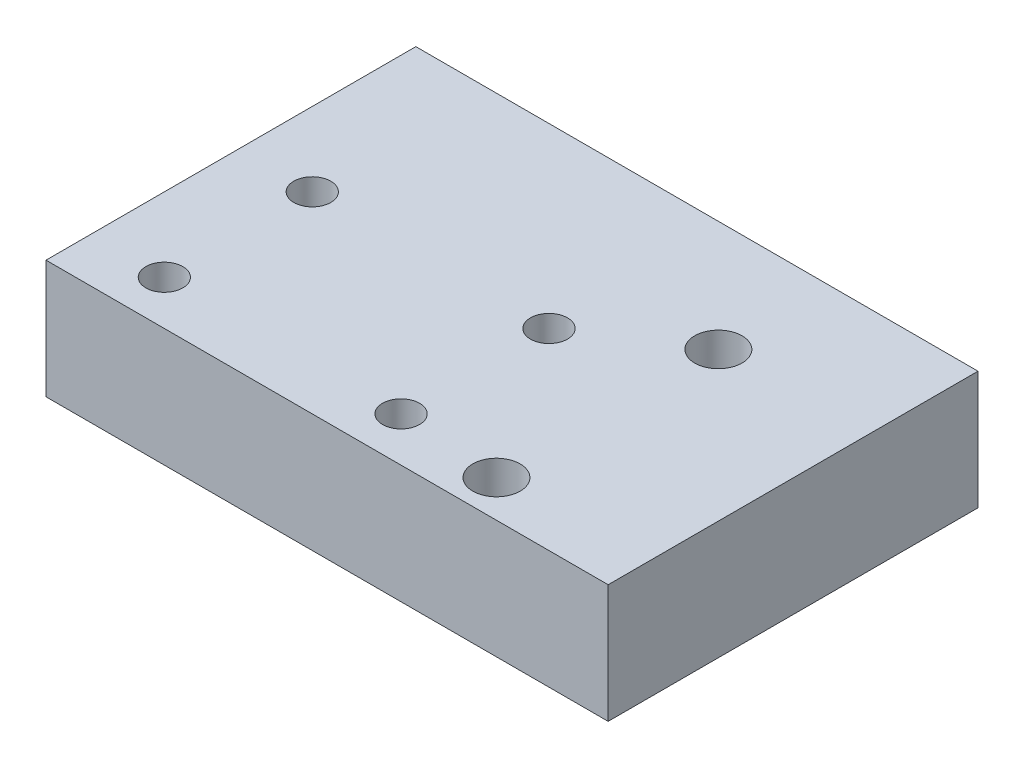
ISO-10303-21;
HEADER;
FILE_DESCRIPTION(('STEP AP214'),'2;1');
FILE_NAME('part.step','',(''),(''),'','','');
FILE_SCHEMA(('AUTOMOTIVE_DESIGN { 1 0 10303 214 1 1 1 1 }'));
ENDSEC;
DATA;
#1=APPLICATION_CONTEXT('core data for automotive mechanical design processes');
#2=APPLICATION_PROTOCOL_DEFINITION('international standard','automotive_design',2000,#1);
#3=PRODUCT_CONTEXT('',#1,'mechanical');
#4=PRODUCT('Part','Part','',(#3));
#5=PRODUCT_RELATED_PRODUCT_CATEGORY('part','',(#4));
#6=PRODUCT_DEFINITION_FORMATION('','',#4);
#7=PRODUCT_DEFINITION_CONTEXT('part definition',#1,'design');
#8=PRODUCT_DEFINITION('design','',#6,#7);
#9=PRODUCT_DEFINITION_SHAPE('','',#8);
#10=(LENGTH_UNIT() NAMED_UNIT(*) SI_UNIT(.MILLI.,.METRE.));
#11=(NAMED_UNIT(*) PLANE_ANGLE_UNIT() SI_UNIT($,.RADIAN.));
#12=(NAMED_UNIT(*) SI_UNIT($,.STERADIAN.) SOLID_ANGLE_UNIT());
#13=UNCERTAINTY_MEASURE_WITH_UNIT(LENGTH_MEASURE(1.E-05),#10,'distance_accuracy_value','');
#14=(GEOMETRIC_REPRESENTATION_CONTEXT(3) GLOBAL_UNCERTAINTY_ASSIGNED_CONTEXT((#13)) GLOBAL_UNIT_ASSIGNED_CONTEXT((#10,
#11,#12)) REPRESENTATION_CONTEXT('',''));
#15=CARTESIAN_POINT('',(0.,0.,0.));
#16=DIRECTION('',(0.,0.,1.));
#17=DIRECTION('',(1.,0.,0.));
#18=AXIS2_PLACEMENT_3D('',#15,#16,#17);
#19=CARTESIAN_POINT('',(19.,8.,12.5));
#20=DIRECTION('',(-1.,0.,0.));
#21=DIRECTION('',(0.,0.,1.));
#22=AXIS2_PLACEMENT_3D('',#19,#20,#21);
#23=PLANE('',#22);
#24=DIRECTION('',(0.,0.,-1.));
#25=VECTOR('',#24,1.);
#26=CARTESIAN_POINT('',(19.,0.,12.5));
#27=LINE('',#26,#25);
#28=CARTESIAN_POINT('',(19.,0.,12.5));
#29=VERTEX_POINT('',#28);
#30=CARTESIAN_POINT('',(19.,0.,-12.5));
#31=VERTEX_POINT('',#30);
#32=EDGE_CURVE('E105',#29,#31,#27,.T.);
#33=ORIENTED_EDGE('',*,*,#32,.T.);
#34=DIRECTION('',(0.,-1.,0.));
#35=VECTOR('',#34,1.);
#36=CARTESIAN_POINT('',(19.,8.,-12.5));
#37=LINE('',#36,#35);
#38=CARTESIAN_POINT('',(19.,8.,-12.5));
#39=VERTEX_POINT('',#38);
#40=EDGE_CURVE('E11',#39,#31,#37,.T.);
#41=ORIENTED_EDGE('',*,*,#40,.F.);
#42=DIRECTION('',(0.,0.,-1.));
#43=VECTOR('',#42,1.);
#44=CARTESIAN_POINT('',(19.,8.,12.5));
#45=LINE('',#44,#43);
#46=CARTESIAN_POINT('',(19.,8.,12.5));
#47=VERTEX_POINT('',#46);
#48=EDGE_CURVE('E93',#47,#39,#45,.T.);
#49=ORIENTED_EDGE('',*,*,#48,.F.);
#50=DIRECTION('',(0.,-1.,0.));
#51=VECTOR('',#50,1.);
#52=CARTESIAN_POINT('',(19.,8.,12.5));
#53=LINE('',#52,#51);
#54=EDGE_CURVE('E101',#47,#29,#53,.T.);
#55=ORIENTED_EDGE('',*,*,#54,.T.);
#56=EDGE_LOOP('',(#33,#41,#49,#55));
#57=FACE_BOUND('',#56,.T.);
#58=ADVANCED_FACE('F42',(#57),#23,.F.);
#59=CARTESIAN_POINT('',(-19.,8.,-12.5));
#60=DIRECTION('',(0.,0.,1.));
#61=DIRECTION('',(1.,0.,0.));
#62=AXIS2_PLACEMENT_3D('',#59,#60,#61);
#63=PLANE('',#62);
#64=DIRECTION('',(-1.,0.,0.));
#65=VECTOR('',#64,1.);
#66=CARTESIAN_POINT('',(-19.,0.,-12.5));
#67=LINE('',#66,#65);
#68=CARTESIAN_POINT('',(-19.,0.,-12.5));
#69=VERTEX_POINT('',#68);
#70=EDGE_CURVE('E97',#31,#69,#67,.T.);
#71=ORIENTED_EDGE('',*,*,#70,.T.);
#72=DIRECTION('',(0.,-1.,0.));
#73=VECTOR('',#72,1.);
#74=CARTESIAN_POINT('',(-19.,8.,-12.5));
#75=LINE('',#74,#73);
#76=CARTESIAN_POINT('',(-19.,8.,-12.5));
#77=VERTEX_POINT('',#76);
#78=EDGE_CURVE('E50',#77,#69,#75,.T.);
#79=ORIENTED_EDGE('',*,*,#78,.F.);
#80=DIRECTION('',(-1.,0.,0.));
#81=VECTOR('',#80,1.);
#82=CARTESIAN_POINT('',(-19.,8.,-12.5));
#83=LINE('',#82,#81);
#84=EDGE_CURVE('E88',#39,#77,#83,.T.);
#85=ORIENTED_EDGE('',*,*,#84,.F.);
#86=ORIENTED_EDGE('',*,*,#40,.T.);
#87=EDGE_LOOP('',(#71,#79,#85,#86));
#88=FACE_BOUND('',#87,.T.);
#89=ADVANCED_FACE('F96',(#88),#63,.F.);
#90=CARTESIAN_POINT('',(-19.,8.,12.5));
#91=DIRECTION('',(1.,0.,0.));
#92=DIRECTION('',(0.,0.,-1.));
#93=AXIS2_PLACEMENT_3D('',#90,#91,#92);
#94=PLANE('',#93);
#95=DIRECTION('',(0.,0.,1.));
#96=VECTOR('',#95,1.);
#97=CARTESIAN_POINT('',(-19.,0.,12.5));
#98=LINE('',#97,#96);
#99=CARTESIAN_POINT('',(-19.,0.,12.5));
#100=VERTEX_POINT('',#99);
#101=EDGE_CURVE('E75',#69,#100,#98,.T.);
#102=ORIENTED_EDGE('',*,*,#101,.T.);
#103=DIRECTION('',(0.,-1.,0.));
#104=VECTOR('',#103,1.);
#105=CARTESIAN_POINT('',(-19.,8.,12.5));
#106=LINE('',#105,#104);
#107=CARTESIAN_POINT('',(-19.,8.,12.5));
#108=VERTEX_POINT('',#107);
#109=EDGE_CURVE('E98',#108,#100,#106,.T.);
#110=ORIENTED_EDGE('',*,*,#109,.F.);
#111=DIRECTION('',(0.,0.,1.));
#112=VECTOR('',#111,1.);
#113=CARTESIAN_POINT('',(-19.,8.,12.5));
#114=LINE('',#113,#112);
#115=EDGE_CURVE('E91',#77,#108,#114,.T.);
#116=ORIENTED_EDGE('',*,*,#115,.F.);
#117=ORIENTED_EDGE('',*,*,#78,.T.);
#118=EDGE_LOOP('',(#102,#110,#116,#117));
#119=FACE_BOUND('',#118,.T.);
#120=ADVANCED_FACE('F99',(#119),#94,.F.);
#121=CARTESIAN_POINT('',(-19.,8.,12.5));
#122=DIRECTION('',(0.,0.,-1.));
#123=DIRECTION('',(-1.,0.,0.));
#124=AXIS2_PLACEMENT_3D('',#121,#122,#123);
#125=PLANE('',#124);
#126=DIRECTION('',(1.,0.,0.));
#127=VECTOR('',#126,1.);
#128=CARTESIAN_POINT('',(-19.,0.,12.5));
#129=LINE('',#128,#127);
#130=EDGE_CURVE('E81',#100,#29,#129,.T.);
#131=ORIENTED_EDGE('',*,*,#130,.T.);
#132=ORIENTED_EDGE('',*,*,#54,.F.);
#133=DIRECTION('',(1.,0.,0.));
#134=VECTOR('',#133,1.);
#135=CARTESIAN_POINT('',(-19.,8.,12.5));
#136=LINE('',#135,#134);
#137=EDGE_CURVE('E58',#108,#47,#136,.T.);
#138=ORIENTED_EDGE('',*,*,#137,.F.);
#139=ORIENTED_EDGE('',*,*,#109,.T.);
#140=EDGE_LOOP('',(#131,#132,#138,#139));
#141=FACE_BOUND('',#140,.T.);
#142=ADVANCED_FACE('F113',(#141),#125,.F.);
#143=CARTESIAN_POINT('',(0.,8.,0.));
#144=DIRECTION('',(0.,-1.,0.));
#145=DIRECTION('',(0.,0.,-1.));
#146=AXIS2_PLACEMENT_3D('',#143,#144,#145);
#147=PLANE('',#146);
#148=CARTESIAN_POINT('',(8.95,8.,10.));
#149=DIRECTION('',(0.,-1.,0.));
#150=DIRECTION('',(0.,0.,-1.));
#151=AXIS2_PLACEMENT_3D('',#148,#149,#150);
#152=CIRCLE('',#151,1.6);
#153=CARTESIAN_POINT('',(8.95,8.,8.4));
#154=VERTEX_POINT('',#153);
#155=EDGE_CURVE('E140',#154,#154,#152,.T.);
#156=ORIENTED_EDGE('',*,*,#155,.T.);
#157=EDGE_LOOP('',(#156));
#158=FACE_BOUND('',#157,.T.);
#159=CARTESIAN_POINT('',(8.95,8.,-5.));
#160=DIRECTION('',(0.,-1.,0.));
#161=DIRECTION('',(0.,0.,-1.));
#162=AXIS2_PLACEMENT_3D('',#159,#160,#161);
#163=CIRCLE('',#162,1.6);
#164=CARTESIAN_POINT('',(8.95,8.,-6.6));
#165=VERTEX_POINT('',#164);
#166=EDGE_CURVE('E143',#165,#165,#163,.T.);
#167=ORIENTED_EDGE('',*,*,#166,.T.);
#168=EDGE_LOOP('',(#167));
#169=FACE_BOUND('',#168,.T.);
#170=CARTESIAN_POINT('',(2.00000000000002,8.,-0.499999999999999));
#171=DIRECTION('',(0.,-1.,0.));
#172=DIRECTION('',(0.,0.,-1.));
#173=AXIS2_PLACEMENT_3D('',#170,#171,#172);
#174=CIRCLE('',#173,1.25);
#175=CARTESIAN_POINT('',(2.00000000000002,8.,-1.75));
#176=VERTEX_POINT('',#175);
#177=EDGE_CURVE('E132',#176,#176,#174,.T.);
#178=ORIENTED_EDGE('',*,*,#177,.T.);
#179=EDGE_LOOP('',(#178));
#180=FACE_BOUND('',#179,.T.);
#181=CARTESIAN_POINT('',(-14.,8.,9.50000000000364));
#182=DIRECTION('',(0.,-1.,0.));
#183=DIRECTION('',(0.,0.,-1.));
#184=AXIS2_PLACEMENT_3D('',#181,#182,#183);
#185=CIRCLE('',#184,1.25);
#186=CARTESIAN_POINT('',(-14.,8.,8.25000000000364));
#187=VERTEX_POINT('',#186);
#188=EDGE_CURVE('E125',#187,#187,#185,.T.);
#189=ORIENTED_EDGE('',*,*,#188,.T.);
#190=EDGE_LOOP('',(#189));
#191=FACE_BOUND('',#190,.T.);
#192=CARTESIAN_POINT('',(-14.,8.,-0.499999999996363));
#193=DIRECTION('',(0.,-1.,0.));
#194=DIRECTION('',(0.,0.,-1.));
#195=AXIS2_PLACEMENT_3D('',#192,#193,#194);
#196=CIRCLE('',#195,1.25);
#197=CARTESIAN_POINT('',(-14.,8.,-1.74999999999636));
#198=VERTEX_POINT('',#197);
#199=EDGE_CURVE('E137',#198,#198,#196,.T.);
#200=ORIENTED_EDGE('',*,*,#199,.T.);
#201=EDGE_LOOP('',(#200));
#202=FACE_BOUND('',#201,.T.);
#203=CARTESIAN_POINT('',(2.00000000000002,8.,9.5));
#204=DIRECTION('',(0.,-1.,0.));
#205=DIRECTION('',(0.,0.,-1.));
#206=AXIS2_PLACEMENT_3D('',#203,#204,#205);
#207=CIRCLE('',#206,1.25);
#208=CARTESIAN_POINT('',(2.00000000000002,8.,8.25));
#209=VERTEX_POINT('',#208);
#210=EDGE_CURVE('E108',#209,#209,#207,.T.);
#211=ORIENTED_EDGE('',*,*,#210,.T.);
#212=EDGE_LOOP('',(#211));
#213=FACE_BOUND('',#212,.T.);
#214=ORIENTED_EDGE('',*,*,#48,.T.);
#215=ORIENTED_EDGE('',*,*,#84,.T.);
#216=ORIENTED_EDGE('',*,*,#115,.T.);
#217=ORIENTED_EDGE('',*,*,#137,.T.);
#218=EDGE_LOOP('',(#214,#215,#216,#217));
#219=FACE_BOUND('',#218,.T.);
#220=ADVANCED_FACE('F89',(#158,#169,#180,#191,#202,#213,#219),#147,.F.);
#221=CARTESIAN_POINT('',(0.,0.,0.));
#222=DIRECTION('',(0.,-1.,0.));
#223=DIRECTION('',(0.,0.,-1.));
#224=AXIS2_PLACEMENT_3D('',#221,#222,#223);
#225=PLANE('',#224);
#226=CARTESIAN_POINT('',(8.95,0.,10.));
#227=DIRECTION('',(0.,-1.,0.));
#228=DIRECTION('',(0.,0.,-1.));
#229=AXIS2_PLACEMENT_3D('',#226,#227,#228);
#230=CIRCLE('',#229,1.6);
#231=CARTESIAN_POINT('',(8.95,0.,8.4));
#232=VERTEX_POINT('',#231);
#233=EDGE_CURVE('E149',#232,#232,#230,.T.);
#234=ORIENTED_EDGE('',*,*,#233,.F.);
#235=EDGE_LOOP('',(#234));
#236=FACE_BOUND('',#235,.T.);
#237=CARTESIAN_POINT('',(8.95,0.,-5.));
#238=DIRECTION('',(0.,-1.,0.));
#239=DIRECTION('',(0.,0.,-1.));
#240=AXIS2_PLACEMENT_3D('',#237,#238,#239);
#241=CIRCLE('',#240,1.6);
#242=CARTESIAN_POINT('',(8.95,0.,-6.6));
#243=VERTEX_POINT('',#242);
#244=EDGE_CURVE('E146',#243,#243,#241,.T.);
#245=ORIENTED_EDGE('',*,*,#244,.F.);
#246=EDGE_LOOP('',(#245));
#247=FACE_BOUND('',#246,.T.);
#248=CARTESIAN_POINT('',(2.00000000000002,0.,-0.499999999999999));
#249=DIRECTION('',(0.,-1.,0.));
#250=DIRECTION('',(0.,0.,-1.));
#251=AXIS2_PLACEMENT_3D('',#248,#249,#250);
#252=CIRCLE('',#251,1.25);
#253=CARTESIAN_POINT('',(2.00000000000002,0.,-1.75));
#254=VERTEX_POINT('',#253);
#255=EDGE_CURVE('E122',#254,#254,#252,.T.);
#256=ORIENTED_EDGE('',*,*,#255,.F.);
#257=EDGE_LOOP('',(#256));
#258=FACE_BOUND('',#257,.T.);
#259=CARTESIAN_POINT('',(-14.,0.,9.50000000000364));
#260=DIRECTION('',(0.,-1.,0.));
#261=DIRECTION('',(0.,0.,-1.));
#262=AXIS2_PLACEMENT_3D('',#259,#260,#261);
#263=CIRCLE('',#262,1.25);
#264=CARTESIAN_POINT('',(-14.,0.,8.25000000000364));
#265=VERTEX_POINT('',#264);
#266=EDGE_CURVE('E128',#265,#265,#263,.T.);
#267=ORIENTED_EDGE('',*,*,#266,.F.);
#268=EDGE_LOOP('',(#267));
#269=FACE_BOUND('',#268,.T.);
#270=CARTESIAN_POINT('',(-14.,0.,-0.499999999996363));
#271=DIRECTION('',(0.,-1.,0.));
#272=DIRECTION('',(0.,0.,-1.));
#273=AXIS2_PLACEMENT_3D('',#270,#271,#272);
#274=CIRCLE('',#273,1.25);
#275=CARTESIAN_POINT('',(-14.,0.,-1.74999999999636));
#276=VERTEX_POINT('',#275);
#277=EDGE_CURVE('E129',#276,#276,#274,.T.);
#278=ORIENTED_EDGE('',*,*,#277,.F.);
#279=EDGE_LOOP('',(#278));
#280=FACE_BOUND('',#279,.T.);
#281=CARTESIAN_POINT('',(2.00000000000002,0.,9.5));
#282=DIRECTION('',(0.,-1.,0.));
#283=DIRECTION('',(0.,0.,-1.));
#284=AXIS2_PLACEMENT_3D('',#281,#282,#283);
#285=CIRCLE('',#284,1.25);
#286=CARTESIAN_POINT('',(2.00000000000002,0.,8.25));
#287=VERTEX_POINT('',#286);
#288=EDGE_CURVE('E119',#287,#287,#285,.T.);
#289=ORIENTED_EDGE('',*,*,#288,.F.);
#290=EDGE_LOOP('',(#289));
#291=FACE_BOUND('',#290,.T.);
#292=ORIENTED_EDGE('',*,*,#32,.F.);
#293=ORIENTED_EDGE('',*,*,#130,.F.);
#294=ORIENTED_EDGE('',*,*,#101,.F.);
#295=ORIENTED_EDGE('',*,*,#70,.F.);
#296=EDGE_LOOP('',(#292,#293,#294,#295));
#297=FACE_BOUND('',#296,.T.);
#298=ADVANCED_FACE('F116',(#236,#247,#258,#269,#280,#291,#297),#225,.T.);
#299=CARTESIAN_POINT('',(2.00000000000002,8.,9.5));
#300=DIRECTION('',(0.,-1.,0.));
#301=DIRECTION('',(0.,0.,-1.));
#302=AXIS2_PLACEMENT_3D('',#299,#300,#301);
#303=CYLINDRICAL_SURFACE('',#302,1.25);
#304=ORIENTED_EDGE('',*,*,#210,.F.);
#305=EDGE_LOOP('',(#304));
#306=FACE_BOUND('',#305,.T.);
#307=ORIENTED_EDGE('',*,*,#288,.T.);
#308=EDGE_LOOP('',(#307));
#309=FACE_BOUND('',#308,.T.);
#310=ADVANCED_FACE('F166',(#306,#309),#303,.F.);
#311=CARTESIAN_POINT('',(-14.,8.,-0.499999999996363));
#312=DIRECTION('',(0.,-1.,0.));
#313=DIRECTION('',(0.,0.,-1.));
#314=AXIS2_PLACEMENT_3D('',#311,#312,#313);
#315=CYLINDRICAL_SURFACE('',#314,1.25);
#316=ORIENTED_EDGE('',*,*,#199,.F.);
#317=EDGE_LOOP('',(#316));
#318=FACE_BOUND('',#317,.T.);
#319=ORIENTED_EDGE('',*,*,#277,.T.);
#320=EDGE_LOOP('',(#319));
#321=FACE_BOUND('',#320,.T.);
#322=ADVANCED_FACE('F179',(#318,#321),#315,.F.);
#323=CARTESIAN_POINT('',(-14.,8.,9.50000000000364));
#324=DIRECTION('',(0.,-1.,0.));
#325=DIRECTION('',(0.,0.,-1.));
#326=AXIS2_PLACEMENT_3D('',#323,#324,#325);
#327=CYLINDRICAL_SURFACE('',#326,1.25);
#328=ORIENTED_EDGE('',*,*,#188,.F.);
#329=EDGE_LOOP('',(#328));
#330=FACE_BOUND('',#329,.T.);
#331=ORIENTED_EDGE('',*,*,#266,.T.);
#332=EDGE_LOOP('',(#331));
#333=FACE_BOUND('',#332,.T.);
#334=ADVANCED_FACE('F186',(#330,#333),#327,.F.);
#335=CARTESIAN_POINT('',(2.00000000000002,8.,-0.499999999999999));
#336=DIRECTION('',(0.,-1.,0.));
#337=DIRECTION('',(0.,0.,-1.));
#338=AXIS2_PLACEMENT_3D('',#335,#336,#337);
#339=CYLINDRICAL_SURFACE('',#338,1.25);
#340=ORIENTED_EDGE('',*,*,#177,.F.);
#341=EDGE_LOOP('',(#340));
#342=FACE_BOUND('',#341,.T.);
#343=ORIENTED_EDGE('',*,*,#255,.T.);
#344=EDGE_LOOP('',(#343));
#345=FACE_BOUND('',#344,.T.);
#346=ADVANCED_FACE('F208',(#342,#345),#339,.F.);
#347=CARTESIAN_POINT('',(8.95,8.,-5.));
#348=DIRECTION('',(0.,-1.,0.));
#349=DIRECTION('',(0.,0.,-1.));
#350=AXIS2_PLACEMENT_3D('',#347,#348,#349);
#351=CYLINDRICAL_SURFACE('',#350,1.6);
#352=ORIENTED_EDGE('',*,*,#166,.F.);
#353=EDGE_LOOP('',(#352));
#354=FACE_BOUND('',#353,.T.);
#355=ORIENTED_EDGE('',*,*,#244,.T.);
#356=EDGE_LOOP('',(#355));
#357=FACE_BOUND('',#356,.T.);
#358=ADVANCED_FACE('F160',(#354,#357),#351,.F.);
#359=CARTESIAN_POINT('',(8.95,8.,10.));
#360=DIRECTION('',(0.,-1.,0.));
#361=DIRECTION('',(0.,0.,-1.));
#362=AXIS2_PLACEMENT_3D('',#359,#360,#361);
#363=CYLINDRICAL_SURFACE('',#362,1.6);
#364=ORIENTED_EDGE('',*,*,#155,.F.);
#365=EDGE_LOOP('',(#364));
#366=FACE_BOUND('',#365,.T.);
#367=ORIENTED_EDGE('',*,*,#233,.T.);
#368=EDGE_LOOP('',(#367));
#369=FACE_BOUND('',#368,.T.);
#370=ADVANCED_FACE('F157',(#366,#369),#363,.F.);
#371=CLOSED_SHELL('',(#58,#89,#120,#142,#220,#298,#310,#322,#334,#346,#358,#370));
#372=MANIFOLD_SOLID_BREP('B2',#371);
#373=ADVANCED_BREP_SHAPE_REPRESENTATION('',(#18,#372),#14);
#374=SHAPE_DEFINITION_REPRESENTATION(#9,#373);
ENDSEC;
END-ISO-10303-21;
